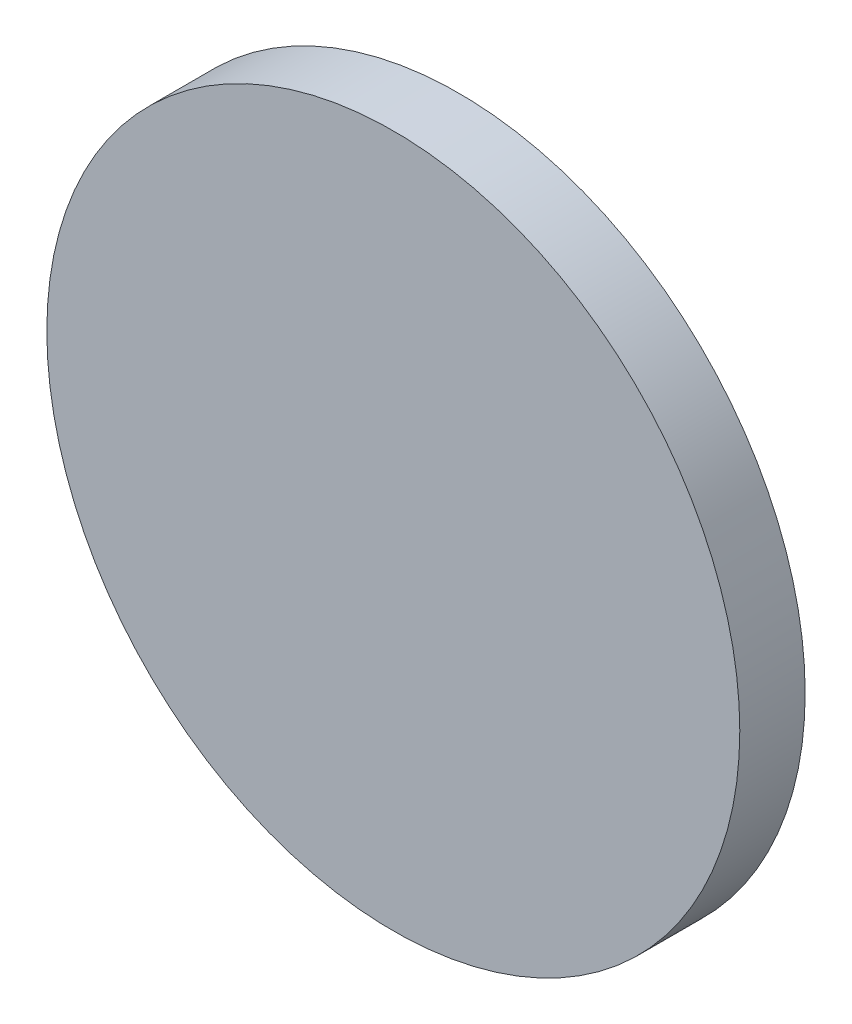
ISO-10303-21;
HEADER;
FILE_DESCRIPTION(('STEP AP214'),'2;1');
FILE_NAME('part.step','',(''),(''),'','','');
FILE_SCHEMA(('AUTOMOTIVE_DESIGN { 1 0 10303 214 1 1 1 1 }'));
ENDSEC;
DATA;
#1=APPLICATION_CONTEXT('core data for automotive mechanical design processes');
#2=APPLICATION_PROTOCOL_DEFINITION('international standard','automotive_design',2000,#1);
#3=PRODUCT_CONTEXT('',#1,'mechanical');
#4=PRODUCT('Part','Part','',(#3));
#5=PRODUCT_RELATED_PRODUCT_CATEGORY('part','',(#4));
#6=PRODUCT_DEFINITION_FORMATION('','',#4);
#7=PRODUCT_DEFINITION_CONTEXT('part definition',#1,'design');
#8=PRODUCT_DEFINITION('design','',#6,#7);
#9=PRODUCT_DEFINITION_SHAPE('','',#8);
#10=(LENGTH_UNIT() NAMED_UNIT(*) SI_UNIT(.MILLI.,.METRE.));
#11=(NAMED_UNIT(*) PLANE_ANGLE_UNIT() SI_UNIT($,.RADIAN.));
#12=(NAMED_UNIT(*) SI_UNIT($,.STERADIAN.) SOLID_ANGLE_UNIT());
#13=UNCERTAINTY_MEASURE_WITH_UNIT(LENGTH_MEASURE(1.E-05),#10,'distance_accuracy_value','');
#14=(GEOMETRIC_REPRESENTATION_CONTEXT(3) GLOBAL_UNCERTAINTY_ASSIGNED_CONTEXT((#13)) GLOBAL_UNIT_ASSIGNED_CONTEXT((#10,
#11,#12)) REPRESENTATION_CONTEXT('',''));
#15=CARTESIAN_POINT('',(0.,0.,0.));
#16=DIRECTION('',(0.,0.,1.));
#17=DIRECTION('',(1.,0.,0.));
#18=AXIS2_PLACEMENT_3D('',#15,#16,#17);
#19=CARTESIAN_POINT('',(0.,0.,10.));
#20=DIRECTION('',(0.,0.,-1.));
#21=DIRECTION('',(-1.,0.,0.));
#22=AXIS2_PLACEMENT_3D('',#19,#20,#21);
#23=CYLINDRICAL_SURFACE('',#22,53.);
#24=CARTESIAN_POINT('',(0.,0.,10.));
#25=DIRECTION('',(0.,0.,1.));
#26=DIRECTION('',(1.,0.,0.));
#27=AXIS2_PLACEMENT_3D('',#24,#25,#26);
#28=CIRCLE('',#27,53.);
#29=CARTESIAN_POINT('',(53.,0.,10.));
#30=VERTEX_POINT('',#29);
#31=EDGE_CURVE('E10',#30,#30,#28,.T.);
#32=ORIENTED_EDGE('',*,*,#31,.F.);
#33=EDGE_LOOP('',(#32));
#34=FACE_BOUND('',#33,.T.);
#35=CARTESIAN_POINT('',(0.,0.,0.));
#36=DIRECTION('',(0.,0.,1.));
#37=DIRECTION('',(1.,0.,0.));
#38=AXIS2_PLACEMENT_3D('',#35,#36,#37);
#39=CIRCLE('',#38,53.);
#40=CARTESIAN_POINT('',(53.,0.,0.));
#41=VERTEX_POINT('',#40);
#42=EDGE_CURVE('E34',#41,#41,#39,.T.);
#43=ORIENTED_EDGE('',*,*,#42,.T.);
#44=EDGE_LOOP('',(#43));
#45=FACE_BOUND('',#44,.T.);
#46=ADVANCED_FACE('F31',(#34,#45),#23,.T.);
#47=CARTESIAN_POINT('',(0.,0.,10.));
#48=DIRECTION('',(0.,0.,1.));
#49=DIRECTION('',(1.,0.,0.));
#50=AXIS2_PLACEMENT_3D('',#47,#48,#49);
#51=PLANE('',#50);
#52=ORIENTED_EDGE('',*,*,#31,.T.);
#53=EDGE_LOOP('',(#52));
#54=FACE_BOUND('',#53,.T.);
#55=ADVANCED_FACE('F46',(#54),#51,.T.);
#56=CARTESIAN_POINT('',(0.,0.,0.));
#57=DIRECTION('',(0.,0.,1.));
#58=DIRECTION('',(1.,0.,0.));
#59=AXIS2_PLACEMENT_3D('',#56,#57,#58);
#60=PLANE('',#59);
#61=ORIENTED_EDGE('',*,*,#42,.F.);
#62=EDGE_LOOP('',(#61));
#63=FACE_BOUND('',#62,.T.);
#64=ADVANCED_FACE('F44',(#63),#60,.F.);
#65=CLOSED_SHELL('',(#46,#55,#64));
#66=MANIFOLD_SOLID_BREP('B2',#65);
#67=ADVANCED_BREP_SHAPE_REPRESENTATION('',(#18,#66),#14);
#68=SHAPE_DEFINITION_REPRESENTATION(#9,#67);
ENDSEC;
END-ISO-10303-21;
